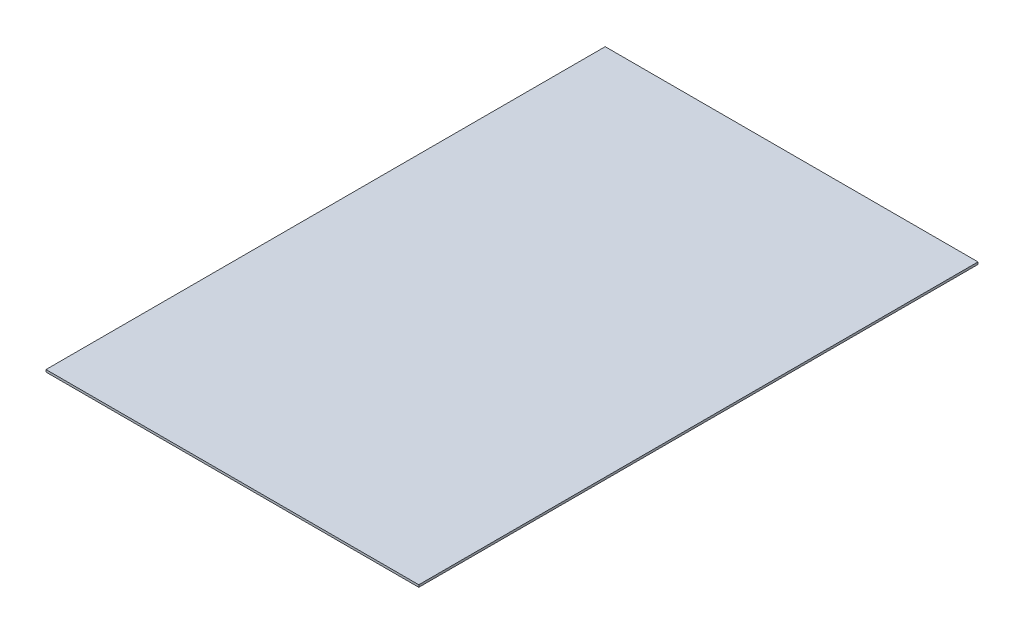
ISO-10303-21;
HEADER;
FILE_DESCRIPTION(('STEP AP214'),'2;1');
FILE_NAME('part.step','',(''),(''),'','','');
FILE_SCHEMA(('AUTOMOTIVE_DESIGN { 1 0 10303 214 1 1 1 1 }'));
ENDSEC;
DATA;
#1=APPLICATION_CONTEXT('core data for automotive mechanical design processes');
#2=APPLICATION_PROTOCOL_DEFINITION('international standard','automotive_design',2000,#1);
#3=PRODUCT_CONTEXT('',#1,'mechanical');
#4=PRODUCT('Part','Part','',(#3));
#5=PRODUCT_RELATED_PRODUCT_CATEGORY('part','',(#4));
#6=PRODUCT_DEFINITION_FORMATION('','',#4);
#7=PRODUCT_DEFINITION_CONTEXT('part definition',#1,'design');
#8=PRODUCT_DEFINITION('design','',#6,#7);
#9=PRODUCT_DEFINITION_SHAPE('','',#8);
#10=(LENGTH_UNIT() NAMED_UNIT(*) SI_UNIT(.MILLI.,.METRE.));
#11=(NAMED_UNIT(*) PLANE_ANGLE_UNIT() SI_UNIT($,.RADIAN.));
#12=(NAMED_UNIT(*) SI_UNIT($,.STERADIAN.) SOLID_ANGLE_UNIT());
#13=UNCERTAINTY_MEASURE_WITH_UNIT(LENGTH_MEASURE(1.E-05),#10,'distance_accuracy_value','');
#14=(GEOMETRIC_REPRESENTATION_CONTEXT(3) GLOBAL_UNCERTAINTY_ASSIGNED_CONTEXT((#13)) GLOBAL_UNIT_ASSIGNED_CONTEXT((#10,
#11,#12)) REPRESENTATION_CONTEXT('',''));
#15=CARTESIAN_POINT('',(0.,0.,0.));
#16=DIRECTION('',(0.,0.,1.));
#17=DIRECTION('',(1.,0.,0.));
#18=AXIS2_PLACEMENT_3D('',#15,#16,#17);
#19=CARTESIAN_POINT('',(0.,30.,0.));
#20=DIRECTION('',(1.,0.,0.));
#21=DIRECTION('',(0.,0.,-1.));
#22=AXIS2_PLACEMENT_3D('',#19,#20,#21);
#23=PLANE('',#22);
#24=DIRECTION('',(0.,0.,1.));
#25=VECTOR('',#24,1.);
#26=CARTESIAN_POINT('',(0.,0.,0.));
#27=LINE('',#26,#25);
#28=CARTESIAN_POINT('',(0.,0.,-7500.));
#29=VERTEX_POINT('',#28);
#30=CARTESIAN_POINT('',(0.,0.,0.));
#31=VERTEX_POINT('',#30);
#32=EDGE_CURVE('E118',#29,#31,#27,.T.);
#33=ORIENTED_EDGE('',*,*,#32,.T.);
#34=DIRECTION('',(0.,-1.,0.));
#35=VECTOR('',#34,1.);
#36=CARTESIAN_POINT('',(0.,30.,0.));
#37=LINE('',#36,#35);
#38=CARTESIAN_POINT('',(0.,30.,0.));
#39=VERTEX_POINT('',#38);
#40=EDGE_CURVE('E11',#39,#31,#37,.T.);
#41=ORIENTED_EDGE('',*,*,#40,.F.);
#42=DIRECTION('',(0.,0.,1.));
#43=VECTOR('',#42,1.);
#44=CARTESIAN_POINT('',(0.,30.,0.));
#45=LINE('',#44,#43);
#46=CARTESIAN_POINT('',(0.,30.,-7500.));
#47=VERTEX_POINT('',#46);
#48=EDGE_CURVE('E104',#47,#39,#45,.T.);
#49=ORIENTED_EDGE('',*,*,#48,.F.);
#50=DIRECTION('',(0.,-1.,0.));
#51=VECTOR('',#50,1.);
#52=CARTESIAN_POINT('',(0.,30.,-7500.));
#53=LINE('',#52,#51);
#54=EDGE_CURVE('E113',#47,#29,#53,.T.);
#55=ORIENTED_EDGE('',*,*,#54,.T.);
#56=EDGE_LOOP('',(#33,#41,#49,#55));
#57=FACE_BOUND('',#56,.T.);
#58=ADVANCED_FACE('F51',(#57),#23,.F.);
#59=CARTESIAN_POINT('',(0.,30.,0.));
#60=DIRECTION('',(0.,0.,-1.));
#61=DIRECTION('',(-1.,0.,0.));
#62=AXIS2_PLACEMENT_3D('',#59,#60,#61);
#63=PLANE('',#62);
#64=DIRECTION('',(1.,0.,0.));
#65=VECTOR('',#64,1.);
#66=CARTESIAN_POINT('',(0.,0.,0.));
#67=LINE('',#66,#65);
#68=CARTESIAN_POINT('',(5000.,0.,0.));
#69=VERTEX_POINT('',#68);
#70=EDGE_CURVE('E109',#31,#69,#67,.T.);
#71=ORIENTED_EDGE('',*,*,#70,.T.);
#72=DIRECTION('',(0.,-1.,0.));
#73=VECTOR('',#72,1.);
#74=CARTESIAN_POINT('',(5000.,30.,0.));
#75=LINE('',#74,#73);
#76=CARTESIAN_POINT('',(5000.,30.,0.));
#77=VERTEX_POINT('',#76);
#78=EDGE_CURVE('E58',#77,#69,#75,.T.);
#79=ORIENTED_EDGE('',*,*,#78,.F.);
#80=DIRECTION('',(1.,0.,0.));
#81=VECTOR('',#80,1.);
#82=CARTESIAN_POINT('',(0.,30.,0.));
#83=LINE('',#82,#81);
#84=EDGE_CURVE('E97',#39,#77,#83,.T.);
#85=ORIENTED_EDGE('',*,*,#84,.F.);
#86=ORIENTED_EDGE('',*,*,#40,.T.);
#87=EDGE_LOOP('',(#71,#79,#85,#86));
#88=FACE_BOUND('',#87,.T.);
#89=ADVANCED_FACE('F107',(#88),#63,.F.);
#90=CARTESIAN_POINT('',(5000.,30.,0.));
#91=DIRECTION('',(-1.,0.,0.));
#92=DIRECTION('',(0.,0.,1.));
#93=AXIS2_PLACEMENT_3D('',#90,#91,#92);
#94=PLANE('',#93);
#95=DIRECTION('',(0.,0.,-1.));
#96=VECTOR('',#95,1.);
#97=CARTESIAN_POINT('',(5000.,0.,0.));
#98=LINE('',#97,#96);
#99=CARTESIAN_POINT('',(5000.,0.,-7500.));
#100=VERTEX_POINT('',#99);
#101=EDGE_CURVE('E82',#69,#100,#98,.T.);
#102=ORIENTED_EDGE('',*,*,#101,.T.);
#103=DIRECTION('',(0.,-1.,0.));
#104=VECTOR('',#103,1.);
#105=CARTESIAN_POINT('',(5000.,30.,-7500.));
#106=LINE('',#105,#104);
#107=CARTESIAN_POINT('',(5000.,30.,-7500.));
#108=VERTEX_POINT('',#107);
#109=EDGE_CURVE('E110',#108,#100,#106,.T.);
#110=ORIENTED_EDGE('',*,*,#109,.F.);
#111=DIRECTION('',(0.,0.,-1.));
#112=VECTOR('',#111,1.);
#113=CARTESIAN_POINT('',(5000.,30.,0.));
#114=LINE('',#113,#112);
#115=EDGE_CURVE('E102',#77,#108,#114,.T.);
#116=ORIENTED_EDGE('',*,*,#115,.F.);
#117=ORIENTED_EDGE('',*,*,#78,.T.);
#118=EDGE_LOOP('',(#102,#110,#116,#117));
#119=FACE_BOUND('',#118,.T.);
#120=ADVANCED_FACE('F112',(#119),#94,.F.);
#121=CARTESIAN_POINT('',(0.,30.,-7500.));
#122=DIRECTION('',(0.,0.,1.));
#123=DIRECTION('',(1.,0.,0.));
#124=AXIS2_PLACEMENT_3D('',#121,#122,#123);
#125=PLANE('',#124);
#126=DIRECTION('',(-1.,0.,0.));
#127=VECTOR('',#126,1.);
#128=CARTESIAN_POINT('',(0.,0.,-7500.));
#129=LINE('',#128,#127);
#130=EDGE_CURVE('E91',#100,#29,#129,.T.);
#131=ORIENTED_EDGE('',*,*,#130,.T.);
#132=ORIENTED_EDGE('',*,*,#54,.F.);
#133=DIRECTION('',(-1.,0.,0.));
#134=VECTOR('',#133,1.);
#135=CARTESIAN_POINT('',(0.,30.,-7500.));
#136=LINE('',#135,#134);
#137=EDGE_CURVE('E66',#108,#47,#136,.T.);
#138=ORIENTED_EDGE('',*,*,#137,.F.);
#139=ORIENTED_EDGE('',*,*,#109,.T.);
#140=EDGE_LOOP('',(#131,#132,#138,#139));
#141=FACE_BOUND('',#140,.T.);
#142=ADVANCED_FACE('F135',(#141),#125,.F.);
#143=CARTESIAN_POINT('',(0.,30.,0.));
#144=DIRECTION('',(0.,-1.,0.));
#145=DIRECTION('',(0.,0.,-1.));
#146=AXIS2_PLACEMENT_3D('',#143,#144,#145);
#147=PLANE('',#146);
#148=ORIENTED_EDGE('',*,*,#48,.T.);
#149=ORIENTED_EDGE('',*,*,#84,.T.);
#150=ORIENTED_EDGE('',*,*,#115,.T.);
#151=ORIENTED_EDGE('',*,*,#137,.T.);
#152=EDGE_LOOP('',(#148,#149,#150,#151));
#153=FACE_BOUND('',#152,.T.);
#154=ADVANCED_FACE('F98',(#153),#147,.F.);
#155=CARTESIAN_POINT('',(0.,0.,0.));
#156=DIRECTION('',(0.,-1.,0.));
#157=DIRECTION('',(0.,0.,-1.));
#158=AXIS2_PLACEMENT_3D('',#155,#156,#157);
#159=PLANE('',#158);
#160=ORIENTED_EDGE('',*,*,#32,.F.);
#161=ORIENTED_EDGE('',*,*,#130,.F.);
#162=ORIENTED_EDGE('',*,*,#101,.F.);
#163=ORIENTED_EDGE('',*,*,#70,.F.);
#164=EDGE_LOOP('',(#160,#161,#162,#163));
#165=FACE_BOUND('',#164,.T.);
#166=ADVANCED_FACE('F134',(#165),#159,.T.);
#167=CLOSED_SHELL('',(#58,#89,#120,#142,#154,#166));
#168=MANIFOLD_SOLID_BREP('B2',#167);
#169=ADVANCED_BREP_SHAPE_REPRESENTATION('',(#18,#168),#14);
#170=SHAPE_DEFINITION_REPRESENTATION(#9,#169);
ENDSEC;
END-ISO-10303-21;
